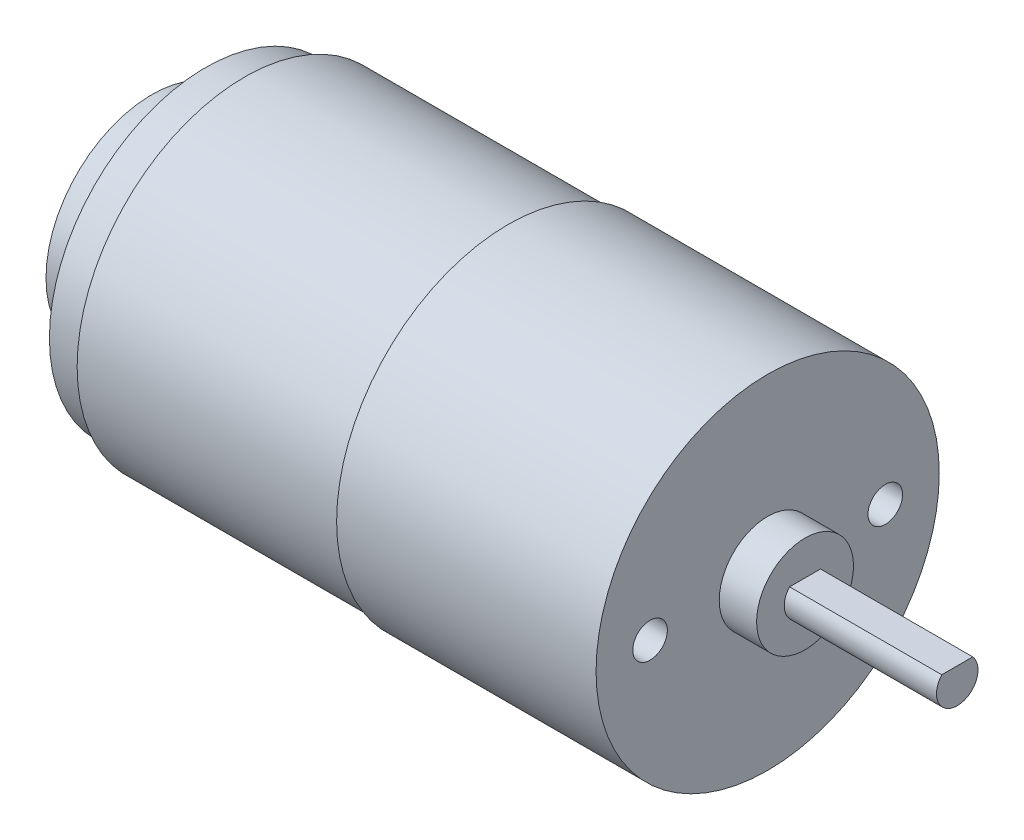
ISO-10303-21;
HEADER;
FILE_DESCRIPTION(('STEP AP214'),'2;1');
FILE_NAME('part.step','',(''),(''),'','','');
FILE_SCHEMA(('AUTOMOTIVE_DESIGN { 1 0 10303 214 1 1 1 1 }'));
ENDSEC;
DATA;
#1=APPLICATION_CONTEXT('core data for automotive mechanical design processes');
#2=APPLICATION_PROTOCOL_DEFINITION('international standard','automotive_design',2000,#1);
#3=PRODUCT_CONTEXT('',#1,'mechanical');
#4=PRODUCT('Part','Part','',(#3));
#5=PRODUCT_RELATED_PRODUCT_CATEGORY('part','',(#4));
#6=PRODUCT_DEFINITION_FORMATION('','',#4);
#7=PRODUCT_DEFINITION_CONTEXT('part definition',#1,'design');
#8=PRODUCT_DEFINITION('design','',#6,#7);
#9=PRODUCT_DEFINITION_SHAPE('','',#8);
#10=(LENGTH_UNIT() NAMED_UNIT(*) SI_UNIT(.MILLI.,.METRE.));
#11=(NAMED_UNIT(*) PLANE_ANGLE_UNIT() SI_UNIT($,.RADIAN.));
#12=(NAMED_UNIT(*) SI_UNIT($,.STERADIAN.) SOLID_ANGLE_UNIT());
#13=UNCERTAINTY_MEASURE_WITH_UNIT(LENGTH_MEASURE(1.E-05),#10,'distance_accuracy_value','');
#14=(GEOMETRIC_REPRESENTATION_CONTEXT(3) GLOBAL_UNCERTAINTY_ASSIGNED_CONTEXT((#13)) GLOBAL_UNIT_ASSIGNED_CONTEXT((#10,
#11,#12)) REPRESENTATION_CONTEXT('',''));
#15=CARTESIAN_POINT('',(0.,0.,0.));
#16=DIRECTION('',(0.,0.,1.));
#17=DIRECTION('',(1.,0.,0.));
#18=AXIS2_PLACEMENT_3D('',#15,#16,#17);
#19=CARTESIAN_POINT('',(15.3262045646661,12.4,0.));
#20=DIRECTION('',(-1.,0.,0.));
#21=DIRECTION('',(0.,0.,1.));
#22=AXIS2_PLACEMENT_3D('',#19,#20,#21);
#23=PLANE('',#22);
#24=CARTESIAN_POINT('',(15.3262045646661,0.,8.5));
#25=DIRECTION('',(1.,0.,0.));
#26=DIRECTION('',(0.,0.,-1.));
#27=AXIS2_PLACEMENT_3D('',#24,#25,#26);
#28=CIRCLE('',#27,1.25);
#29=CARTESIAN_POINT('',(15.3262045646661,0.,7.25));
#30=VERTEX_POINT('',#29);
#31=EDGE_CURVE('E156',#30,#30,#28,.T.);
#32=ORIENTED_EDGE('',*,*,#31,.F.);
#33=EDGE_LOOP('',(#32));
#34=FACE_BOUND('',#33,.T.);
#35=CARTESIAN_POINT('',(15.3262045646661,0.,0.));
#36=DIRECTION('',(-1.,0.,0.));
#37=DIRECTION('',(0.,0.,1.));
#38=AXIS2_PLACEMENT_3D('',#35,#36,#37);
#39=CIRCLE('',#38,12.4);
#40=CARTESIAN_POINT('',(15.3262045646661,0.,12.4));
#41=VERTEX_POINT('',#40);
#42=EDGE_CURVE('E87',#41,#41,#39,.T.);
#43=ORIENTED_EDGE('',*,*,#42,.F.);
#44=EDGE_LOOP('',(#43));
#45=FACE_BOUND('',#44,.T.);
#46=CARTESIAN_POINT('',(15.3262045646661,0.,0.));
#47=DIRECTION('',(-1.,0.,0.));
#48=DIRECTION('',(0.,0.,1.));
#49=AXIS2_PLACEMENT_3D('',#46,#47,#48);
#50=CIRCLE('',#49,3.5);
#51=CARTESIAN_POINT('',(15.3262045646661,0.,3.5));
#52=VERTEX_POINT('',#51);
#53=EDGE_CURVE('E84',#52,#52,#50,.T.);
#54=ORIENTED_EDGE('',*,*,#53,.T.);
#55=EDGE_LOOP('',(#54));
#56=FACE_BOUND('',#55,.T.);
#57=CARTESIAN_POINT('',(15.3262045646661,0.,-8.5));
#58=DIRECTION('',(-1.,0.,0.));
#59=DIRECTION('',(0.,0.,1.));
#60=AXIS2_PLACEMENT_3D('',#57,#58,#59);
#61=CIRCLE('',#60,1.25);
#62=CARTESIAN_POINT('',(15.3262045646661,0.,-7.25));
#63=VERTEX_POINT('',#62);
#64=EDGE_CURVE('E154',#63,#63,#61,.T.);
#65=ORIENTED_EDGE('',*,*,#64,.T.);
#66=EDGE_LOOP('',(#65));
#67=FACE_BOUND('',#66,.T.);
#68=ADVANCED_FACE('F36',(#34,#45,#56,#67),#23,.F.);
#69=CARTESIAN_POINT('',(-29.1737954353339,0.,0.));
#70=DIRECTION('',(1.,0.,0.));
#71=DIRECTION('',(0.,0.,-1.));
#72=AXIS2_PLACEMENT_3D('',#69,#70,#71);
#73=PLANE('',#72);
#74=CARTESIAN_POINT('',(-29.1737954353339,0.,0.));
#75=DIRECTION('',(-1.,0.,0.));
#76=DIRECTION('',(0.,0.,1.));
#77=AXIS2_PLACEMENT_3D('',#74,#75,#76);
#78=CIRCLE('',#77,7.65012679628065);
#79=CARTESIAN_POINT('',(-29.1737954353339,0.,7.65012679628065));
#80=VERTEX_POINT('',#79);
#81=EDGE_CURVE('E11',#80,#80,#78,.T.);
#82=ORIENTED_EDGE('',*,*,#81,.T.);
#83=EDGE_LOOP('',(#82));
#84=FACE_BOUND('',#83,.T.);
#85=ADVANCED_FACE('F38',(#84),#73,.F.);
#86=CARTESIAN_POINT('',(-38.0292476754015,0.,0.));
#87=DIRECTION('',(-1.,0.,0.));
#88=DIRECTION('',(0.,0.,1.));
#89=AXIS2_PLACEMENT_3D('',#86,#87,#88);
#90=CYLINDRICAL_SURFACE('',#89,7.65012679628065);
#91=ORIENTED_EDGE('',*,*,#81,.F.);
#92=EDGE_LOOP('',(#91));
#93=FACE_BOUND('',#92,.T.);
#94=CARTESIAN_POINT('',(-25.287235841082,0.,0.));
#95=DIRECTION('',(-1.,0.,0.));
#96=DIRECTION('',(0.,0.,1.));
#97=AXIS2_PLACEMENT_3D('',#94,#95,#96);
#98=CIRCLE('',#97,7.65012679628065);
#99=CARTESIAN_POINT('',(-25.287235841082,0.,7.65012679628065));
#100=VERTEX_POINT('',#99);
#101=EDGE_CURVE('E44',#100,#100,#98,.T.);
#102=ORIENTED_EDGE('',*,*,#101,.T.);
#103=EDGE_LOOP('',(#102));
#104=FACE_BOUND('',#103,.T.);
#105=ADVANCED_FACE('F107',(#93,#104),#90,.T.);
#106=CARTESIAN_POINT('',(-25.287235841082,7.65012679628065,0.));
#107=DIRECTION('',(1.,0.,0.));
#108=DIRECTION('',(0.,0.,-1.));
#109=AXIS2_PLACEMENT_3D('',#106,#107,#108);
#110=PLANE('',#109);
#111=ORIENTED_EDGE('',*,*,#101,.F.);
#112=EDGE_LOOP('',(#111));
#113=FACE_BOUND('',#112,.T.);
#114=CARTESIAN_POINT('',(-25.287235841082,0.,0.));
#115=DIRECTION('',(-1.,0.,0.));
#116=DIRECTION('',(0.,0.,1.));
#117=AXIS2_PLACEMENT_3D('',#114,#115,#116);
#118=CIRCLE('',#117,11.2907016060862);
#119=CARTESIAN_POINT('',(-25.287235841082,0.,11.2907016060862));
#120=VERTEX_POINT('',#119);
#121=EDGE_CURVE('E102',#120,#120,#118,.T.);
#122=ORIENTED_EDGE('',*,*,#121,.T.);
#123=EDGE_LOOP('',(#122));
#124=FACE_BOUND('',#123,.T.);
#125=ADVANCED_FACE('F109',(#113,#124),#110,.F.);
#126=CARTESIAN_POINT('',(-38.0292476754015,0.,0.));
#127=DIRECTION('',(-1.,0.,0.));
#128=DIRECTION('',(0.,0.,1.));
#129=AXIS2_PLACEMENT_3D('',#126,#127,#128);
#130=CYLINDRICAL_SURFACE('',#129,11.2907016060862);
#131=ORIENTED_EDGE('',*,*,#121,.F.);
#132=EDGE_LOOP('',(#131));
#133=FACE_BOUND('',#132,.T.);
#134=CARTESIAN_POINT('',(-22.4737954353339,0.,0.));
#135=DIRECTION('',(-1.,0.,0.));
#136=DIRECTION('',(0.,0.,1.));
#137=AXIS2_PLACEMENT_3D('',#134,#135,#136);
#138=CIRCLE('',#137,11.2907016060862);
#139=CARTESIAN_POINT('',(-22.4737954353339,0.,11.2907016060862));
#140=VERTEX_POINT('',#139);
#141=EDGE_CURVE('E99',#140,#140,#138,.T.);
#142=ORIENTED_EDGE('',*,*,#141,.T.);
#143=EDGE_LOOP('',(#142));
#144=FACE_BOUND('',#143,.T.);
#145=ADVANCED_FACE('F112',(#133,#144),#130,.T.);
#146=CARTESIAN_POINT('',(-22.4737954353339,11.2907016060862,0.));
#147=DIRECTION('',(1.,0.,0.));
#148=DIRECTION('',(0.,0.,-1.));
#149=AXIS2_PLACEMENT_3D('',#146,#147,#148);
#150=PLANE('',#149);
#151=ORIENTED_EDGE('',*,*,#141,.F.);
#152=EDGE_LOOP('',(#151));
#153=FACE_BOUND('',#152,.T.);
#154=CARTESIAN_POINT('',(-22.4737954353339,0.,0.));
#155=DIRECTION('',(-1.,0.,0.));
#156=DIRECTION('',(0.,0.,1.));
#157=AXIS2_PLACEMENT_3D('',#154,#155,#156);
#158=CIRCLE('',#157,12.1);
#159=CARTESIAN_POINT('',(-22.4737954353339,0.,12.1));
#160=VERTEX_POINT('',#159);
#161=EDGE_CURVE('E96',#160,#160,#158,.T.);
#162=ORIENTED_EDGE('',*,*,#161,.T.);
#163=EDGE_LOOP('',(#162));
#164=FACE_BOUND('',#163,.T.);
#165=ADVANCED_FACE('F118',(#153,#164),#150,.F.);
#166=CARTESIAN_POINT('',(-38.0292476754015,0.,0.));
#167=DIRECTION('',(-1.,0.,0.));
#168=DIRECTION('',(0.,0.,1.));
#169=AXIS2_PLACEMENT_3D('',#166,#167,#168);
#170=CYLINDRICAL_SURFACE('',#169,12.1);
#171=ORIENTED_EDGE('',*,*,#161,.F.);
#172=EDGE_LOOP('',(#171));
#173=FACE_BOUND('',#172,.T.);
#174=CARTESIAN_POINT('',(-3.4237954353339,0.,0.));
#175=DIRECTION('',(-1.,0.,0.));
#176=DIRECTION('',(0.,0.,1.));
#177=AXIS2_PLACEMENT_3D('',#174,#175,#176);
#178=CIRCLE('',#177,12.1);
#179=CARTESIAN_POINT('',(-3.4237954353339,0.,12.1));
#180=VERTEX_POINT('',#179);
#181=EDGE_CURVE('E93',#180,#180,#178,.T.);
#182=ORIENTED_EDGE('',*,*,#181,.T.);
#183=EDGE_LOOP('',(#182));
#184=FACE_BOUND('',#183,.T.);
#185=ADVANCED_FACE('F124',(#173,#184),#170,.T.);
#186=CARTESIAN_POINT('',(-3.4237954353339,12.1,0.));
#187=DIRECTION('',(1.,0.,0.));
#188=DIRECTION('',(0.,0.,-1.));
#189=AXIS2_PLACEMENT_3D('',#186,#187,#188);
#190=PLANE('',#189);
#191=ORIENTED_EDGE('',*,*,#181,.F.);
#192=EDGE_LOOP('',(#191));
#193=FACE_BOUND('',#192,.T.);
#194=CARTESIAN_POINT('',(-3.4237954353339,0.,0.));
#195=DIRECTION('',(-1.,0.,0.));
#196=DIRECTION('',(0.,0.,1.));
#197=AXIS2_PLACEMENT_3D('',#194,#195,#196);
#198=CIRCLE('',#197,12.4);
#199=CARTESIAN_POINT('',(-3.4237954353339,0.,12.4));
#200=VERTEX_POINT('',#199);
#201=EDGE_CURVE('E90',#200,#200,#198,.T.);
#202=ORIENTED_EDGE('',*,*,#201,.T.);
#203=EDGE_LOOP('',(#202));
#204=FACE_BOUND('',#203,.T.);
#205=ADVANCED_FACE('F130',(#193,#204),#190,.F.);
#206=CARTESIAN_POINT('',(-38.0292476754015,0.,0.));
#207=DIRECTION('',(-1.,0.,0.));
#208=DIRECTION('',(0.,0.,1.));
#209=AXIS2_PLACEMENT_3D('',#206,#207,#208);
#210=CYLINDRICAL_SURFACE('',#209,12.4);
#211=ORIENTED_EDGE('',*,*,#201,.F.);
#212=EDGE_LOOP('',(#211));
#213=FACE_BOUND('',#212,.T.);
#214=ORIENTED_EDGE('',*,*,#42,.T.);
#215=EDGE_LOOP('',(#214));
#216=FACE_BOUND('',#215,.T.);
#217=ADVANCED_FACE('F136',(#213,#216),#210,.T.);
#218=CARTESIAN_POINT('',(-38.0292476754015,0.,0.));
#219=DIRECTION('',(-1.,0.,0.));
#220=DIRECTION('',(0.,0.,1.));
#221=AXIS2_PLACEMENT_3D('',#218,#219,#220);
#222=CYLINDRICAL_SURFACE('',#221,3.5);
#223=ORIENTED_EDGE('',*,*,#53,.F.);
#224=EDGE_LOOP('',(#223));
#225=FACE_BOUND('',#224,.T.);
#226=CARTESIAN_POINT('',(18.0262045646661,0.,0.));
#227=DIRECTION('',(-1.,0.,0.));
#228=DIRECTION('',(0.,0.,1.));
#229=AXIS2_PLACEMENT_3D('',#226,#227,#228);
#230=CIRCLE('',#229,3.5);
#231=CARTESIAN_POINT('',(18.0262045646661,0.,3.5));
#232=VERTEX_POINT('',#231);
#233=EDGE_CURVE('E78',#232,#232,#230,.T.);
#234=ORIENTED_EDGE('',*,*,#233,.T.);
#235=EDGE_LOOP('',(#234));
#236=FACE_BOUND('',#235,.T.);
#237=ADVANCED_FACE('F142',(#225,#236),#222,.T.);
#238=CARTESIAN_POINT('',(18.0262045646661,3.5,0.));
#239=DIRECTION('',(-1.,0.,0.));
#240=DIRECTION('',(0.,0.,1.));
#241=AXIS2_PLACEMENT_3D('',#238,#239,#240);
#242=PLANE('',#241);
#243=ORIENTED_EDGE('',*,*,#233,.F.);
#244=EDGE_LOOP('',(#243));
#245=FACE_BOUND('',#244,.T.);
#246=CARTESIAN_POINT('',(18.0262045646661,0.,0.));
#247=DIRECTION('',(-1.,0.,0.));
#248=DIRECTION('',(0.,0.,1.));
#249=AXIS2_PLACEMENT_3D('',#246,#247,#248);
#250=CIRCLE('',#249,1.5);
#251=CARTESIAN_POINT('',(18.0262045646661,1.,-1.11803398874989));
#252=VERTEX_POINT('',#251);
#253=CARTESIAN_POINT('',(18.0262045646661,1.,1.11803398874989));
#254=VERTEX_POINT('',#253);
#255=EDGE_CURVE('E74',#252,#254,#250,.T.);
#256=ORIENTED_EDGE('',*,*,#255,.T.);
#257=DIRECTION('',(0.,0.,-1.));
#258=VECTOR('',#257,1.);
#259=CARTESIAN_POINT('',(18.0262045646661,1.,0.));
#260=LINE('',#259,#258);
#261=EDGE_CURVE('E66',#254,#252,#260,.T.);
#262=ORIENTED_EDGE('',*,*,#261,.T.);
#263=EDGE_LOOP('',(#256,#262));
#264=FACE_BOUND('',#263,.T.);
#265=ADVANCED_FACE('F167',(#245,#264),#242,.F.);
#266=CARTESIAN_POINT('',(-38.0292476754015,0.,0.));
#267=DIRECTION('',(-1.,0.,0.));
#268=DIRECTION('',(0.,0.,1.));
#269=AXIS2_PLACEMENT_3D('',#266,#267,#268);
#270=CYLINDRICAL_SURFACE('',#269,1.5);
#271=CARTESIAN_POINT('',(29.0262045646661,0.,0.));
#272=DIRECTION('',(-1.,0.,0.));
#273=DIRECTION('',(0.,0.,1.));
#274=AXIS2_PLACEMENT_3D('',#271,#272,#273);
#275=CIRCLE('',#274,1.5);
#276=CARTESIAN_POINT('',(29.0262045646661,1.,-1.11803398874989));
#277=VERTEX_POINT('',#276);
#278=CARTESIAN_POINT('',(29.0262045646661,1.,1.11803398874989));
#279=VERTEX_POINT('',#278);
#280=EDGE_CURVE('E72',#277,#279,#275,.T.);
#281=ORIENTED_EDGE('',*,*,#280,.T.);
#282=DIRECTION('',(1.,0.,0.));
#283=VECTOR('',#282,1.);
#284=CARTESIAN_POINT('',(18.0262045646661,1.,1.11803398874989));
#285=LINE('',#284,#283);
#286=EDGE_CURVE('E51',#254,#279,#285,.T.);
#287=ORIENTED_EDGE('',*,*,#286,.F.);
#288=ORIENTED_EDGE('',*,*,#255,.F.);
#289=DIRECTION('',(1.,0.,0.));
#290=VECTOR('',#289,1.);
#291=CARTESIAN_POINT('',(18.0262045646661,1.,-1.11803398874989));
#292=LINE('',#291,#290);
#293=EDGE_CURVE('E57',#252,#277,#292,.T.);
#294=ORIENTED_EDGE('',*,*,#293,.T.);
#295=EDGE_LOOP('',(#281,#287,#288,#294));
#296=FACE_BOUND('',#295,.T.);
#297=ADVANCED_FACE('F71',(#296),#270,.T.);
#298=CARTESIAN_POINT('',(29.0262045646661,1.5,0.));
#299=DIRECTION('',(-1.,0.,0.));
#300=DIRECTION('',(0.,0.,1.));
#301=AXIS2_PLACEMENT_3D('',#298,#299,#300);
#302=PLANE('',#301);
#303=ORIENTED_EDGE('',*,*,#280,.F.);
#304=DIRECTION('',(0.,0.,-1.));
#305=VECTOR('',#304,1.);
#306=CARTESIAN_POINT('',(29.0262045646661,1.,0.));
#307=LINE('',#306,#305);
#308=EDGE_CURVE('E61',#279,#277,#307,.T.);
#309=ORIENTED_EDGE('',*,*,#308,.F.);
#310=EDGE_LOOP('',(#303,#309));
#311=FACE_BOUND('',#310,.T.);
#312=ADVANCED_FACE('F76',(#311),#302,.F.);
#313=CARTESIAN_POINT('',(18.0262045646661,1.,0.));
#314=DIRECTION('',(0.,-1.,0.));
#315=DIRECTION('',(0.,0.,-1.));
#316=AXIS2_PLACEMENT_3D('',#313,#314,#315);
#317=PLANE('',#316);
#318=ORIENTED_EDGE('',*,*,#308,.T.);
#319=ORIENTED_EDGE('',*,*,#293,.F.);
#320=ORIENTED_EDGE('',*,*,#261,.F.);
#321=ORIENTED_EDGE('',*,*,#286,.T.);
#322=EDGE_LOOP('',(#318,#319,#320,#321));
#323=FACE_BOUND('',#322,.T.);
#324=ADVANCED_FACE('F62',(#323),#317,.F.);
#325=CARTESIAN_POINT('',(2.3262045646661,0.,8.5));
#326=DIRECTION('',(1.,0.,0.));
#327=DIRECTION('',(0.,0.,-1.));
#328=AXIS2_PLACEMENT_3D('',#325,#326,#327);
#329=CYLINDRICAL_SURFACE('',#328,1.25);
#330=CARTESIAN_POINT('',(2.3262045646661,0.,8.5));
#331=DIRECTION('',(1.,0.,0.));
#332=DIRECTION('',(0.,0.,-1.));
#333=AXIS2_PLACEMENT_3D('',#330,#331,#332);
#334=CIRCLE('',#333,1.25);
#335=CARTESIAN_POINT('',(2.3262045646661,0.,7.25));
#336=VERTEX_POINT('',#335);
#337=EDGE_CURVE('E161',#336,#336,#334,.T.);
#338=ORIENTED_EDGE('',*,*,#337,.F.);
#339=EDGE_LOOP('',(#338));
#340=FACE_BOUND('',#339,.T.);
#341=ORIENTED_EDGE('',*,*,#31,.T.);
#342=EDGE_LOOP('',(#341));
#343=FACE_BOUND('',#342,.T.);
#344=ADVANCED_FACE('F205',(#340,#343),#329,.F.);
#345=CARTESIAN_POINT('',(2.3262045646661,0.,8.5));
#346=DIRECTION('',(1.,0.,0.));
#347=DIRECTION('',(0.,0.,-1.));
#348=AXIS2_PLACEMENT_3D('',#345,#346,#347);
#349=PLANE('',#348);
#350=ORIENTED_EDGE('',*,*,#337,.T.);
#351=EDGE_LOOP('',(#350));
#352=FACE_BOUND('',#351,.T.);
#353=ADVANCED_FACE('F210',(#352),#349,.T.);
#354=CARTESIAN_POINT('',(2.3262045646661,0.,-8.5));
#355=DIRECTION('',(1.,0.,0.));
#356=DIRECTION('',(0.,0.,-1.));
#357=AXIS2_PLACEMENT_3D('',#354,#355,#356);
#358=CYLINDRICAL_SURFACE('',#357,1.25);
#359=CARTESIAN_POINT('',(2.3262045646661,0.,-8.5));
#360=DIRECTION('',(-1.,0.,0.));
#361=DIRECTION('',(0.,0.,1.));
#362=AXIS2_PLACEMENT_3D('',#359,#360,#361);
#363=CIRCLE('',#362,1.25);
#364=CARTESIAN_POINT('',(2.3262045646661,0.,-7.25));
#365=VERTEX_POINT('',#364);
#366=EDGE_CURVE('E67',#365,#365,#363,.T.);
#367=ORIENTED_EDGE('',*,*,#366,.T.);
#368=EDGE_LOOP('',(#367));
#369=FACE_BOUND('',#368,.T.);
#370=ORIENTED_EDGE('',*,*,#64,.F.);
#371=EDGE_LOOP('',(#370));
#372=FACE_BOUND('',#371,.T.);
#373=ADVANCED_FACE('F220',(#369,#372),#358,.F.);
#374=CARTESIAN_POINT('',(2.3262045646661,0.,-8.5));
#375=DIRECTION('',(-1.,0.,0.));
#376=DIRECTION('',(0.,0.,1.));
#377=AXIS2_PLACEMENT_3D('',#374,#375,#376);
#378=PLANE('',#377);
#379=ORIENTED_EDGE('',*,*,#366,.F.);
#380=EDGE_LOOP('',(#379));
#381=FACE_BOUND('',#380,.T.);
#382=ADVANCED_FACE('F231',(#381),#378,.F.);
#383=CLOSED_SHELL('',(#68,#85,#105,#125,#145,#165,#185,#205,#217,#237,#265,#297,#312,#324,#344,
#353,#373,#382));
#384=MANIFOLD_SOLID_BREP('B2',#383);
#385=ADVANCED_BREP_SHAPE_REPRESENTATION('',(#18,#384),#14);
#386=SHAPE_DEFINITION_REPRESENTATION(#9,#385);
ENDSEC;
END-ISO-10303-21;
